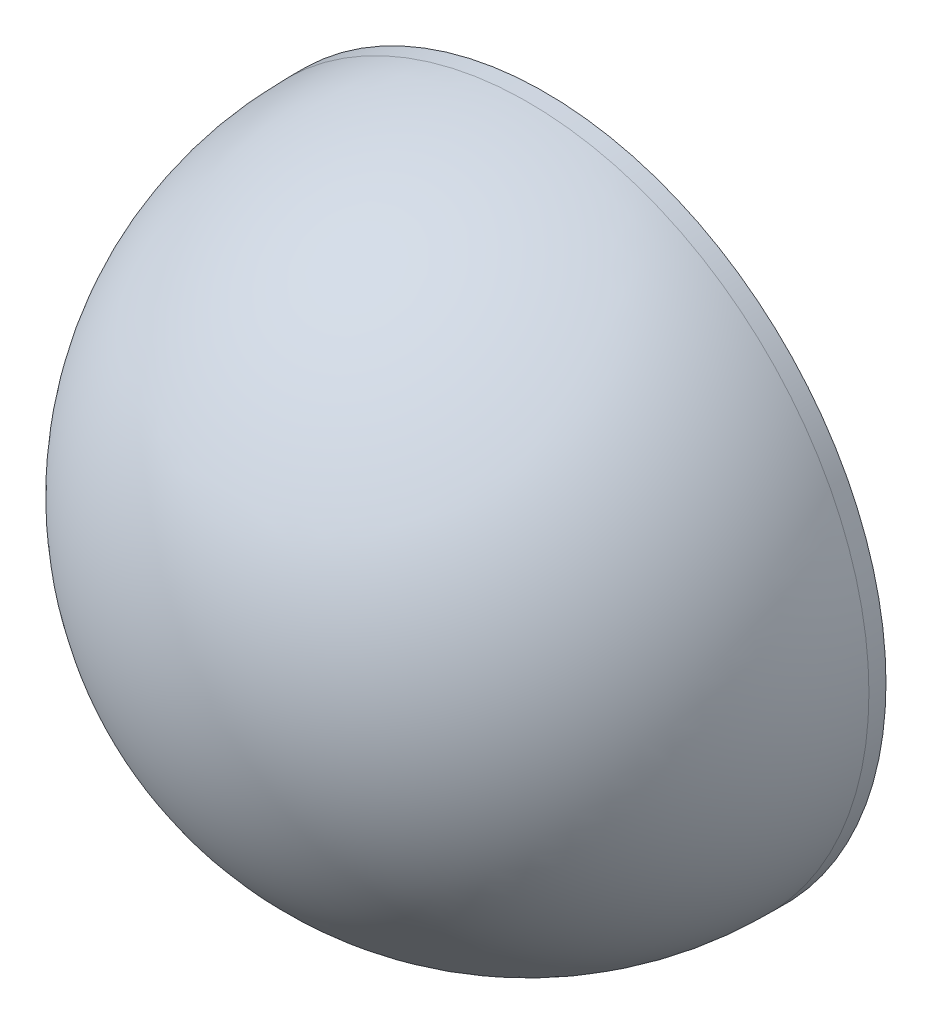
ISO-10303-21;
HEADER;
FILE_DESCRIPTION(('STEP AP214'),'2;1');
FILE_NAME('part.step','',(''),(''),'','','');
FILE_SCHEMA(('AUTOMOTIVE_DESIGN { 1 0 10303 214 1 1 1 1 }'));
ENDSEC;
DATA;
#1=APPLICATION_CONTEXT('core data for automotive mechanical design processes');
#2=APPLICATION_PROTOCOL_DEFINITION('international standard','automotive_design',2000,#1);
#3=PRODUCT_CONTEXT('',#1,'mechanical');
#4=PRODUCT('Part','Part','',(#3));
#5=PRODUCT_RELATED_PRODUCT_CATEGORY('part','',(#4));
#6=PRODUCT_DEFINITION_FORMATION('','',#4);
#7=PRODUCT_DEFINITION_CONTEXT('part definition',#1,'design');
#8=PRODUCT_DEFINITION('design','',#6,#7);
#9=PRODUCT_DEFINITION_SHAPE('','',#8);
#10=(LENGTH_UNIT() NAMED_UNIT(*) SI_UNIT(.MILLI.,.METRE.));
#11=(NAMED_UNIT(*) PLANE_ANGLE_UNIT() SI_UNIT($,.RADIAN.));
#12=(NAMED_UNIT(*) SI_UNIT($,.STERADIAN.) SOLID_ANGLE_UNIT());
#13=UNCERTAINTY_MEASURE_WITH_UNIT(LENGTH_MEASURE(1.E-05),#10,'distance_accuracy_value','');
#14=(GEOMETRIC_REPRESENTATION_CONTEXT(3) GLOBAL_UNCERTAINTY_ASSIGNED_CONTEXT((#13)) GLOBAL_UNIT_ASSIGNED_CONTEXT((#10,
#11,#12)) REPRESENTATION_CONTEXT('',''));
#15=CARTESIAN_POINT('',(0.,0.,0.));
#16=DIRECTION('',(0.,0.,1.));
#17=DIRECTION('',(1.,0.,0.));
#18=AXIS2_PLACEMENT_3D('',#15,#16,#17);
#19=CARTESIAN_POINT('',(-47.1485135754382,20.7453459731928,1.));
#20=DIRECTION('',(0.,0.,-1.));
#21=DIRECTION('',(-1.,0.,0.));
#22=AXIS2_PLACEMENT_3D('',#19,#20,#21);
#23=CYLINDRICAL_SURFACE('',#22,20.);
#24=CARTESIAN_POINT('',(-47.1485135754382,20.7453459731928,1.));
#25=DIRECTION('',(0.,0.,1.));
#26=DIRECTION('',(1.,0.,0.));
#27=AXIS2_PLACEMENT_3D('',#24,#25,#26);
#28=CIRCLE('',#27,20.);
#29=CARTESIAN_POINT('',(-27.1485135754382,20.7453459731928,1.));
#30=VERTEX_POINT('',#29);
#31=EDGE_CURVE('E10',#30,#30,#28,.T.);
#32=ORIENTED_EDGE('',*,*,#31,.F.);
#33=EDGE_LOOP('',(#32));
#34=FACE_BOUND('',#33,.T.);
#35=CARTESIAN_POINT('',(-47.1485135754382,20.7453459731928,0.));
#36=DIRECTION('',(0.,0.,1.));
#37=DIRECTION('',(1.,0.,0.));
#38=AXIS2_PLACEMENT_3D('',#35,#36,#37);
#39=CIRCLE('',#38,20.);
#40=CARTESIAN_POINT('',(-27.1485135754382,20.7453459731928,0.));
#41=VERTEX_POINT('',#40);
#42=EDGE_CURVE('E41',#41,#41,#39,.T.);
#43=ORIENTED_EDGE('',*,*,#42,.T.);
#44=EDGE_LOOP('',(#43));
#45=FACE_BOUND('',#44,.T.);
#46=ADVANCED_FACE('F32',(#34,#45),#23,.T.);
#47=CARTESIAN_POINT('',(-47.1485135754382,20.7453459731928,1.));
#48=DIRECTION('',(0.,0.,1.));
#49=DIRECTION('',(1.,0.,0.));
#50=AXIS2_PLACEMENT_3D('',#47,#48,#49);
#51=SPHERICAL_SURFACE('',#50,20.);
#52=ORIENTED_EDGE('',*,*,#31,.T.);
#53=EDGE_LOOP('',(#52));
#54=FACE_BOUND('',#53,.T.);
#55=ADVANCED_FACE('F34',(#54),#51,.T.);
#56=CARTESIAN_POINT('',(-47.1485135754382,20.7453459731928,0.));
#57=DIRECTION('',(0.,0.,1.));
#58=DIRECTION('',(1.,0.,0.));
#59=AXIS2_PLACEMENT_3D('',#56,#57,#58);
#60=PLANE('',#59);
#61=ORIENTED_EDGE('',*,*,#42,.F.);
#62=EDGE_LOOP('',(#61));
#63=FACE_BOUND('',#62,.T.);
#64=ADVANCED_FACE('F77',(#63),#60,.F.);
#65=CLOSED_SHELL('',(#46,#55,#64));
#66=CARTESIAN_POINT('',(-47.1485135754382,20.7453459731928,20.));
#67=DIRECTION('',(0.,0.,-1.));
#68=DIRECTION('',(-1.,0.,0.));
#69=AXIS2_PLACEMENT_3D('',#66,#67,#68);
#70=CYLINDRICAL_SURFACE('',#69,5.);
#71=CARTESIAN_POINT('',(-47.1485135754382,20.7453459731928,17.2480768092719));
#72=DIRECTION('',(0.,0.,-1.));
#73=DIRECTION('',(-1.,0.,0.));
#74=AXIS2_PLACEMENT_3D('',#71,#72,#73);
#75=CIRCLE('',#74,5.);
#76=CARTESIAN_POINT('',(-52.1485135754382,20.7453459731928,17.2480768092719));
#77=VERTEX_POINT('',#76);
#78=EDGE_CURVE('E49',#77,#77,#75,.F.);
#79=ORIENTED_EDGE('',*,*,#78,.F.);
#80=EDGE_LOOP('',(#79));
#81=FACE_BOUND('',#80,.T.);
#82=CARTESIAN_POINT('',(-47.1485135754382,20.7453459731928,1.));
#83=DIRECTION('',(0.,0.,-1.));
#84=DIRECTION('',(-1.,0.,0.));
#85=AXIS2_PLACEMENT_3D('',#82,#83,#84);
#86=CIRCLE('',#85,5.);
#87=CARTESIAN_POINT('',(-52.1485135754382,20.7453459731928,1.));
#88=VERTEX_POINT('',#87);
#89=EDGE_CURVE('E36',#88,#88,#86,.F.);
#90=ORIENTED_EDGE('',*,*,#89,.T.);
#91=EDGE_LOOP('',(#90));
#92=FACE_BOUND('',#91,.T.);
#93=ADVANCED_FACE('F57',(#81,#92),#70,.T.);
#94=CARTESIAN_POINT('',(-47.1485135754382,20.7453459731928,1.));
#95=DIRECTION('',(0.,0.,1.));
#96=DIRECTION('',(1.,0.,0.));
#97=AXIS2_PLACEMENT_3D('',#94,#95,#96);
#98=SPHERICAL_SURFACE('',#97,17.);
#99=ORIENTED_EDGE('',*,*,#78,.T.);
#100=EDGE_LOOP('',(#99));
#101=FACE_BOUND('',#100,.T.);
#102=CARTESIAN_POINT('',(-47.1485135754382,20.7453459731928,1.));
#103=DIRECTION('',(0.,0.,1.));
#104=DIRECTION('',(1.,0.,0.));
#105=AXIS2_PLACEMENT_3D('',#102,#103,#104);
#106=CIRCLE('',#105,17.);
#107=CARTESIAN_POINT('',(-30.1485135754382,20.7453459731928,1.));
#108=VERTEX_POINT('',#107);
#109=EDGE_CURVE('E46',#108,#108,#106,.T.);
#110=ORIENTED_EDGE('',*,*,#109,.F.);
#111=EDGE_LOOP('',(#110));
#112=FACE_BOUND('',#111,.T.);
#113=ADVANCED_FACE('F62',(#101,#112),#98,.F.);
#114=CARTESIAN_POINT('',(-47.1485135754382,20.7453459731928,1.));
#115=DIRECTION('',(0.,0.,-1.));
#116=DIRECTION('',(-1.,0.,0.));
#117=AXIS2_PLACEMENT_3D('',#114,#115,#116);
#118=PLANE('',#117);
#119=ORIENTED_EDGE('',*,*,#89,.F.);
#120=EDGE_LOOP('',(#119));
#121=FACE_BOUND('',#120,.T.);
#122=ORIENTED_EDGE('',*,*,#109,.T.);
#123=EDGE_LOOP('',(#122));
#124=FACE_BOUND('',#123,.T.);
#125=ADVANCED_FACE('F59',(#121,#124),#118,.F.);
#126=CLOSED_SHELL('',(#93,#113,#125));
#127=ORIENTED_CLOSED_SHELL('',*,#126,.T.);
#128=BREP_WITH_VOIDS('B2',#65,(#127));
#129=ADVANCED_BREP_SHAPE_REPRESENTATION('',(#18,#128),#14);
#130=SHAPE_DEFINITION_REPRESENTATION(#9,#129);
ENDSEC;
END-ISO-10303-21;
